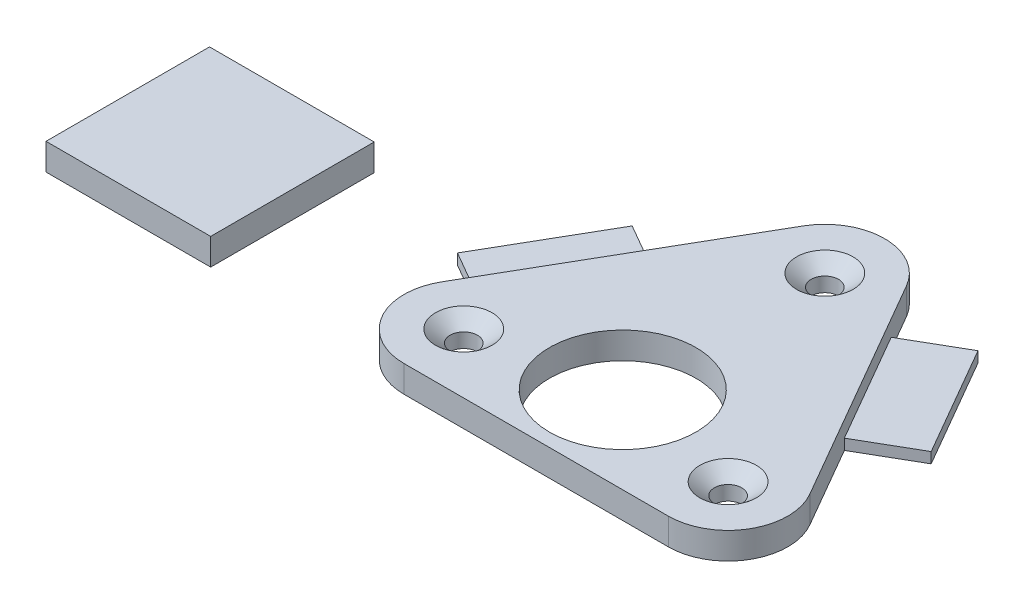
ISO-10303-21;
HEADER;
FILE_DESCRIPTION(('STEP AP214'),'2;1');
FILE_NAME('part.step','',(''),(''),'','','');
FILE_SCHEMA(('AUTOMOTIVE_DESIGN { 1 0 10303 214 1 1 1 1 }'));
ENDSEC;
DATA;
#1=APPLICATION_CONTEXT('core data for automotive mechanical design processes');
#2=APPLICATION_PROTOCOL_DEFINITION('international standard','automotive_design',2000,#1);
#3=PRODUCT_CONTEXT('',#1,'mechanical');
#4=PRODUCT('Part','Part','',(#3));
#5=PRODUCT_RELATED_PRODUCT_CATEGORY('part','',(#4));
#6=PRODUCT_DEFINITION_FORMATION('','',#4);
#7=PRODUCT_DEFINITION_CONTEXT('part definition',#1,'design');
#8=PRODUCT_DEFINITION('design','',#6,#7);
#9=PRODUCT_DEFINITION_SHAPE('','',#8);
#10=(LENGTH_UNIT() NAMED_UNIT(*) SI_UNIT(.MILLI.,.METRE.));
#11=(NAMED_UNIT(*) PLANE_ANGLE_UNIT() SI_UNIT($,.RADIAN.));
#12=(NAMED_UNIT(*) SI_UNIT($,.STERADIAN.) SOLID_ANGLE_UNIT());
#13=UNCERTAINTY_MEASURE_WITH_UNIT(LENGTH_MEASURE(1.E-05),#10,'distance_accuracy_value','');
#14=(GEOMETRIC_REPRESENTATION_CONTEXT(3) GLOBAL_UNCERTAINTY_ASSIGNED_CONTEXT((#13)) GLOBAL_UNIT_ASSIGNED_CONTEXT((#10,
#11,#12)) REPRESENTATION_CONTEXT('',''));
#15=CARTESIAN_POINT('',(0.,0.,0.));
#16=DIRECTION('',(0.,0.,1.));
#17=DIRECTION('',(1.,0.,0.));
#18=AXIS2_PLACEMENT_3D('',#15,#16,#17);
#19=CARTESIAN_POINT('',(-40.3862761223692,-27.6571980713941,8.7169554565989));
#20=DIRECTION('',(1.,0.,0.));
#21=DIRECTION('',(0.,0.,-1.));
#22=AXIS2_PLACEMENT_3D('',#19,#20,#21);
#23=PLANE('',#22);
#24=DIRECTION('',(0.,0.,1.));
#25=VECTOR('',#24,1.);
#26=CARTESIAN_POINT('',(-40.3862761223692,0.,8.7169554565989));
#27=LINE('',#26,#25);
#28=CARTESIAN_POINT('',(-40.3862761223692,0.,-10.7712343473452));
#29=VERTEX_POINT('',#28);
#30=CARTESIAN_POINT('',(-40.3862761223692,0.,8.7169554565989));
#31=VERTEX_POINT('',#30);
#32=EDGE_CURVE('E59',#29,#31,#27,.T.);
#33=ORIENTED_EDGE('',*,*,#32,.F.);
#34=DIRECTION('',(0.,1.,0.));
#35=VECTOR('',#34,1.);
#36=CARTESIAN_POINT('',(-40.3862761223692,-27.6571980713941,-10.7712343473452));
#37=LINE('',#36,#35);
#38=CARTESIAN_POINT('',(-40.3862761223692,3.175,-10.7712343473452));
#39=VERTEX_POINT('',#38);
#40=EDGE_CURVE('E87',#29,#39,#37,.T.);
#41=ORIENTED_EDGE('',*,*,#40,.T.);
#42=DIRECTION('',(0.,0.,-1.));
#43=VECTOR('',#42,1.);
#44=CARTESIAN_POINT('',(-40.3862761223692,3.175,8.7169554565989));
#45=LINE('',#44,#43);
#46=CARTESIAN_POINT('',(-40.3862761223692,3.175,8.7169554565989));
#47=VERTEX_POINT('',#46);
#48=EDGE_CURVE('E91',#47,#39,#45,.T.);
#49=ORIENTED_EDGE('',*,*,#48,.F.);
#50=DIRECTION('',(0.,1.,0.));
#51=VECTOR('',#50,1.);
#52=CARTESIAN_POINT('',(-40.3862761223692,-27.6571980713941,8.7169554565989));
#53=LINE('',#52,#51);
#54=EDGE_CURVE('E114',#31,#47,#53,.T.);
#55=ORIENTED_EDGE('',*,*,#54,.F.);
#56=EDGE_LOOP('',(#33,#41,#49,#55));
#57=FACE_BOUND('',#56,.T.);
#58=ADVANCED_FACE('F51',(#57),#23,.T.);
#59=CARTESIAN_POINT('',(-40.3862761223692,-27.6571980713941,8.7169554565989));
#60=DIRECTION('',(0.,0.,1.));
#61=DIRECTION('',(1.,0.,0.));
#62=AXIS2_PLACEMENT_3D('',#59,#60,#61);
#63=PLANE('',#62);
#64=DIRECTION('',(-1.,0.,0.));
#65=VECTOR('',#64,1.);
#66=CARTESIAN_POINT('',(-40.3862761223692,0.,8.7169554565989));
#67=LINE('',#66,#65);
#68=CARTESIAN_POINT('',(-60.0110325113228,0.,8.7169554565989));
#69=VERTEX_POINT('',#68);
#70=EDGE_CURVE('E65',#31,#69,#67,.T.);
#71=ORIENTED_EDGE('',*,*,#70,.F.);
#72=ORIENTED_EDGE('',*,*,#54,.T.);
#73=DIRECTION('',(1.,0.,0.));
#74=VECTOR('',#73,1.);
#75=CARTESIAN_POINT('',(-40.3862761223692,3.175,8.7169554565989));
#76=LINE('',#75,#74);
#77=CARTESIAN_POINT('',(-60.0110325113228,3.175,8.7169554565989));
#78=VERTEX_POINT('',#77);
#79=EDGE_CURVE('E96',#78,#47,#76,.T.);
#80=ORIENTED_EDGE('',*,*,#79,.F.);
#81=DIRECTION('',(0.,1.,0.));
#82=VECTOR('',#81,1.);
#83=CARTESIAN_POINT('',(-60.0110325113228,-27.6571980713941,8.7169554565989));
#84=LINE('',#83,#82);
#85=EDGE_CURVE('E117',#69,#78,#84,.T.);
#86=ORIENTED_EDGE('',*,*,#85,.F.);
#87=EDGE_LOOP('',(#71,#72,#80,#86));
#88=FACE_BOUND('',#87,.T.);
#89=ADVANCED_FACE('F123',(#88),#63,.T.);
#90=CARTESIAN_POINT('',(-60.0110325113228,-27.6571980713941,8.7169554565989));
#91=DIRECTION('',(-1.,0.,0.));
#92=DIRECTION('',(0.,0.,1.));
#93=AXIS2_PLACEMENT_3D('',#90,#91,#92);
#94=PLANE('',#93);
#95=DIRECTION('',(0.,0.,-1.));
#96=VECTOR('',#95,1.);
#97=CARTESIAN_POINT('',(-60.0110325113228,0.,8.7169554565989));
#98=LINE('',#97,#96);
#99=CARTESIAN_POINT('',(-60.0110325113228,0.,-10.7712343473452));
#100=VERTEX_POINT('',#99);
#101=EDGE_CURVE('E116',#69,#100,#98,.T.);
#102=ORIENTED_EDGE('',*,*,#101,.F.);
#103=ORIENTED_EDGE('',*,*,#85,.T.);
#104=DIRECTION('',(0.,0.,1.));
#105=VECTOR('',#104,1.);
#106=CARTESIAN_POINT('',(-60.0110325113228,3.175,8.7169554565989));
#107=LINE('',#106,#105);
#108=CARTESIAN_POINT('',(-60.0110325113228,3.175,-10.7712343473452));
#109=VERTEX_POINT('',#108);
#110=EDGE_CURVE('E104',#109,#78,#107,.T.);
#111=ORIENTED_EDGE('',*,*,#110,.F.);
#112=DIRECTION('',(0.,1.,0.));
#113=VECTOR('',#112,1.);
#114=CARTESIAN_POINT('',(-60.0110325113228,-27.6571980713941,-10.7712343473452));
#115=LINE('',#114,#113);
#116=EDGE_CURVE('E95',#100,#109,#115,.T.);
#117=ORIENTED_EDGE('',*,*,#116,.F.);
#118=EDGE_LOOP('',(#102,#103,#111,#117));
#119=FACE_BOUND('',#118,.T.);
#120=ADVANCED_FACE('F121',(#119),#94,.T.);
#121=CARTESIAN_POINT('',(-40.3862761223692,-27.6571980713941,-10.7712343473452));
#122=DIRECTION('',(0.,0.,-1.));
#123=DIRECTION('',(-1.,0.,0.));
#124=AXIS2_PLACEMENT_3D('',#121,#122,#123);
#125=PLANE('',#124);
#126=DIRECTION('',(1.,0.,0.));
#127=VECTOR('',#126,1.);
#128=CARTESIAN_POINT('',(-40.3862761223692,0.,-10.7712343473452));
#129=LINE('',#128,#127);
#130=EDGE_CURVE('E12',#100,#29,#129,.T.);
#131=ORIENTED_EDGE('',*,*,#130,.F.);
#132=ORIENTED_EDGE('',*,*,#116,.T.);
#133=DIRECTION('',(-1.,0.,0.));
#134=VECTOR('',#133,1.);
#135=CARTESIAN_POINT('',(-40.3862761223692,3.175,-10.7712343473452));
#136=LINE('',#135,#134);
#137=EDGE_CURVE('E98',#39,#109,#136,.T.);
#138=ORIENTED_EDGE('',*,*,#137,.F.);
#139=ORIENTED_EDGE('',*,*,#40,.F.);
#140=EDGE_LOOP('',(#131,#132,#138,#139));
#141=FACE_BOUND('',#140,.T.);
#142=ADVANCED_FACE('F99',(#141),#125,.T.);
#143=CARTESIAN_POINT('',(0.,3.175,0.));
#144=DIRECTION('',(0.,1.,0.));
#145=DIRECTION('',(0.,0.,1.));
#146=AXIS2_PLACEMENT_3D('',#143,#144,#145);
#147=PLANE('',#146);
#148=ORIENTED_EDGE('',*,*,#48,.T.);
#149=ORIENTED_EDGE('',*,*,#137,.T.);
#150=ORIENTED_EDGE('',*,*,#110,.T.);
#151=ORIENTED_EDGE('',*,*,#79,.T.);
#152=EDGE_LOOP('',(#148,#149,#150,#151));
#153=FACE_BOUND('',#152,.T.);
#154=ADVANCED_FACE('F106',(#153),#147,.T.);
#155=CARTESIAN_POINT('',(15.7498844033853,0.,3.19273021599999));
#156=DIRECTION('',(0.,1.,0.));
#157=DIRECTION('',(0.,0.,1.));
#158=AXIS2_PLACEMENT_3D('',#155,#156,#157);
#159=PLANE('',#158);
#160=ORIENTED_EDGE('',*,*,#32,.T.);
#161=ORIENTED_EDGE('',*,*,#70,.T.);
#162=ORIENTED_EDGE('',*,*,#101,.T.);
#163=ORIENTED_EDGE('',*,*,#130,.T.);
#164=EDGE_LOOP('',(#160,#161,#162,#163));
#165=FACE_BOUND('',#164,.T.);
#166=ADVANCED_FACE('F125',(#165),#159,.F.);
#167=CLOSED_SHELL('',(#58,#89,#120,#142,#154,#166));
#168=MANIFOLD_SOLID_BREP('B2',#167);
#169=CARTESIAN_POINT('',(15.7498844033853,3.175,3.19273021599999));
#170=DIRECTION('',(0.,1.,0.));
#171=DIRECTION('',(0.,0.,1.));
#172=AXIS2_PLACEMENT_3D('',#169,#170,#171);
#173=PLANE('',#172);
#174=CARTESIAN_POINT('',(0.,3.175,-24.086869784));
#175=DIRECTION('',(0.,1.,0.));
#176=DIRECTION('',(0.,0.,1.));
#177=AXIS2_PLACEMENT_3D('',#174,#175,#176);
#178=CIRCLE('',#177,3.3655);
#179=CARTESIAN_POINT('',(0.,3.175,-20.721369784));
#180=VERTEX_POINT('',#179);
#181=EDGE_CURVE('E333',#180,#180,#178,.T.);
#182=ORIENTED_EDGE('',*,*,#181,.F.);
#183=EDGE_LOOP('',(#182));
#184=FACE_BOUND('',#183,.T.);
#185=CARTESIAN_POINT('',(-15.7498844033853,3.175,3.19273021600001));
#186=DIRECTION('',(0.,1.,0.));
#187=DIRECTION('',(0.,0.,1.));
#188=AXIS2_PLACEMENT_3D('',#185,#186,#187);
#189=CIRCLE('',#188,3.3655);
#190=CARTESIAN_POINT('',(-15.7498844033853,3.175,6.55823021600001));
#191=VERTEX_POINT('',#190);
#192=EDGE_CURVE('E349',#191,#191,#189,.T.);
#193=ORIENTED_EDGE('',*,*,#192,.F.);
#194=EDGE_LOOP('',(#193));
#195=FACE_BOUND('',#194,.T.);
#196=CARTESIAN_POINT('',(15.7498844033853,3.175,3.19273021599999));
#197=DIRECTION('',(0.,1.,0.));
#198=DIRECTION('',(0.,0.,1.));
#199=AXIS2_PLACEMENT_3D('',#196,#197,#198);
#200=CIRCLE('',#199,3.3655);
#201=CARTESIAN_POINT('',(15.7498844033853,3.175,6.55823021599999));
#202=VERTEX_POINT('',#201);
#203=EDGE_CURVE('E358',#202,#202,#200,.T.);
#204=ORIENTED_EDGE('',*,*,#203,.F.);
#205=EDGE_LOOP('',(#204));
#206=FACE_BOUND('',#205,.T.);
#207=CARTESIAN_POINT('',(15.7498844033853,3.175,3.19273021599999));
#208=DIRECTION('',(0.,1.,0.));
#209=DIRECTION('',(0.,0.,1.));
#210=AXIS2_PLACEMENT_3D('',#207,#208,#209);
#211=CIRCLE('',#210,7.12601978400001);
#212=CARTESIAN_POINT('',(15.7498844033853,3.175,10.31875));
#213=VERTEX_POINT('',#212);
#214=CARTESIAN_POINT('',(21.9211985641998,3.175,-0.370279676000014));
#215=VERTEX_POINT('',#214);
#216=EDGE_CURVE('E375',#213,#215,#211,.T.);
#217=ORIENTED_EDGE('',*,*,#216,.T.);
#218=DIRECTION('',(-0.5,0.,-0.866025403784438));
#219=VECTOR('',#218,1.);
#220=CARTESIAN_POINT('',(6.1713141608145,3.175,-27.649879676));
#221=LINE('',#220,#219);
#222=CARTESIAN_POINT('',(6.1713141608145,3.175,-27.649879676));
#223=VERTEX_POINT('',#222);
#224=EDGE_CURVE('E378',#215,#223,#221,.T.);
#225=ORIENTED_EDGE('',*,*,#224,.T.);
#226=CARTESIAN_POINT('',(0.,3.175,-24.086869784));
#227=DIRECTION('',(0.,1.,0.));
#228=DIRECTION('',(0.,0.,1.));
#229=AXIS2_PLACEMENT_3D('',#226,#227,#228);
#230=CIRCLE('',#229,7.126019784);
#231=CARTESIAN_POINT('',(-6.1713141608145,3.175,-27.649879676));
#232=VERTEX_POINT('',#231);
#233=EDGE_CURVE('E381',#223,#232,#230,.T.);
#234=ORIENTED_EDGE('',*,*,#233,.T.);
#235=DIRECTION('',(-0.5,0.,0.866025403784438));
#236=VECTOR('',#235,1.);
#237=CARTESIAN_POINT('',(-6.1713141608145,3.175,-27.649879676));
#238=LINE('',#237,#236);
#239=CARTESIAN_POINT('',(-21.9211985641998,3.175,-0.370279675999992));
#240=VERTEX_POINT('',#239);
#241=EDGE_CURVE('E383',#232,#240,#238,.T.);
#242=ORIENTED_EDGE('',*,*,#241,.T.);
#243=CARTESIAN_POINT('',(-15.7498844033853,3.175,3.19273021600001));
#244=DIRECTION('',(0.,1.,0.));
#245=DIRECTION('',(0.,0.,1.));
#246=AXIS2_PLACEMENT_3D('',#243,#244,#245);
#247=CIRCLE('',#246,7.12601978400001);
#248=CARTESIAN_POINT('',(-15.7498844033853,3.175,10.31875));
#249=VERTEX_POINT('',#248);
#250=EDGE_CURVE('E387',#240,#249,#247,.T.);
#251=ORIENTED_EDGE('',*,*,#250,.T.);
#252=DIRECTION('',(1.,0.,0.));
#253=VECTOR('',#252,1.);
#254=CARTESIAN_POINT('',(15.7498844033853,3.175,10.31875));
#255=LINE('',#254,#253);
#256=EDGE_CURVE('E408',#249,#213,#255,.T.);
#257=ORIENTED_EDGE('',*,*,#256,.T.);
#258=EDGE_LOOP('',(#217,#225,#234,#242,#251,#257));
#259=FACE_BOUND('',#258,.T.);
#260=CARTESIAN_POINT('',(0.,3.175,0.));
#261=DIRECTION('',(0.,1.,0.));
#262=DIRECTION('',(0.,0.,1.));
#263=AXIS2_PLACEMENT_3D('',#260,#261,#262);
#264=CIRCLE('',#263,8.73125);
#265=CARTESIAN_POINT('',(0.,3.175,8.73125));
#266=VERTEX_POINT('',#265);
#267=EDGE_CURVE('E368',#266,#266,#264,.T.);
#268=ORIENTED_EDGE('',*,*,#267,.F.);
#269=EDGE_LOOP('',(#268));
#270=FACE_BOUND('',#269,.T.);
#271=ADVANCED_FACE('F176',(#184,#195,#206,#259,#270),#173,.T.);
#272=CARTESIAN_POINT('',(15.7498844033853,0.,3.19273021599999));
#273=DIRECTION('',(0.,1.,0.));
#274=DIRECTION('',(0.,0.,1.));
#275=AXIS2_PLACEMENT_3D('',#272,#273,#274);
#276=PLANE('',#275);
#277=CARTESIAN_POINT('',(0.,0.,-24.086869784));
#278=DIRECTION('',(0.,1.,0.));
#279=DIRECTION('',(0.,0.,1.));
#280=AXIS2_PLACEMENT_3D('',#277,#278,#279);
#281=CIRCLE('',#280,1.63195);
#282=CARTESIAN_POINT('',(0.,0.,-22.454919784));
#283=VERTEX_POINT('',#282);
#284=EDGE_CURVE('E346',#283,#283,#281,.T.);
#285=ORIENTED_EDGE('',*,*,#284,.T.);
#286=EDGE_LOOP('',(#285));
#287=FACE_BOUND('',#286,.T.);
#288=CARTESIAN_POINT('',(-15.7498844033853,0.,3.19273021600001));
#289=DIRECTION('',(0.,1.,0.));
#290=DIRECTION('',(0.,0.,1.));
#291=AXIS2_PLACEMENT_3D('',#288,#289,#290);
#292=CIRCLE('',#291,1.63195);
#293=CARTESIAN_POINT('',(-15.7498844033853,0.,4.82468021600001));
#294=VERTEX_POINT('',#293);
#295=EDGE_CURVE('E355',#294,#294,#292,.T.);
#296=ORIENTED_EDGE('',*,*,#295,.T.);
#297=EDGE_LOOP('',(#296));
#298=FACE_BOUND('',#297,.T.);
#299=CARTESIAN_POINT('',(15.7498844033853,0.,3.19273021599999));
#300=DIRECTION('',(0.,1.,0.));
#301=DIRECTION('',(0.,0.,1.));
#302=AXIS2_PLACEMENT_3D('',#299,#300,#301);
#303=CIRCLE('',#302,1.63195);
#304=CARTESIAN_POINT('',(15.7498844033853,0.,4.82468021599999));
#305=VERTEX_POINT('',#304);
#306=EDGE_CURVE('E364',#305,#305,#303,.T.);
#307=ORIENTED_EDGE('',*,*,#306,.T.);
#308=EDGE_LOOP('',(#307));
#309=FACE_BOUND('',#308,.T.);
#310=CARTESIAN_POINT('',(15.7498844033853,0.,3.19273021599999));
#311=DIRECTION('',(0.,1.,0.));
#312=DIRECTION('',(0.,0.,1.));
#313=AXIS2_PLACEMENT_3D('',#310,#311,#312);
#314=CIRCLE('',#313,7.12601978400001);
#315=CARTESIAN_POINT('',(15.7498844033853,0.,10.31875));
#316=VERTEX_POINT('',#315);
#317=CARTESIAN_POINT('',(21.9211985641998,0.,-0.370279676000014));
#318=VERTEX_POINT('',#317);
#319=EDGE_CURVE('E371',#316,#318,#314,.T.);
#320=ORIENTED_EDGE('',*,*,#319,.F.);
#321=DIRECTION('',(1.,0.,0.));
#322=VECTOR('',#321,1.);
#323=CARTESIAN_POINT('',(15.7498844033853,0.,10.31875));
#324=LINE('',#323,#322);
#325=CARTESIAN_POINT('',(-15.7498844033853,0.,10.31875));
#326=VERTEX_POINT('',#325);
#327=EDGE_CURVE('E379',#326,#316,#324,.T.);
#328=ORIENTED_EDGE('',*,*,#327,.F.);
#329=CARTESIAN_POINT('',(-15.7498844033853,0.,3.19273021600001));
#330=DIRECTION('',(0.,1.,0.));
#331=DIRECTION('',(0.,0.,1.));
#332=AXIS2_PLACEMENT_3D('',#329,#330,#331);
#333=CIRCLE('',#332,7.12601978400001);
#334=CARTESIAN_POINT('',(-21.9211985641998,0.,-0.370279675999992));
#335=VERTEX_POINT('',#334);
#336=EDGE_CURVE('E398',#335,#326,#333,.T.);
#337=ORIENTED_EDGE('',*,*,#336,.F.);
#338=DIRECTION('',(-0.5,0.,0.866025403784438));
#339=VECTOR('',#338,1.);
#340=CARTESIAN_POINT('',(-6.1713141608145,0.,-27.649879676));
#341=LINE('',#340,#339);
#342=CARTESIAN_POINT('',(-20.392453659478,0.,-3.01814352279022));
#343=VERTEX_POINT('',#342);
#344=EDGE_CURVE('E399',#343,#335,#341,.T.);
#345=ORIENTED_EDGE('',*,*,#344,.F.);
#346=DIRECTION('',(-0.866025403784439,0.,-0.5));
#347=VECTOR('',#346,1.);
#348=CARTESIAN_POINT('',(-20.392453659478,0.,-3.01814352279022));
#349=LINE('',#348,#347);
#350=CARTESIAN_POINT('',(-25.8754915799858,0.,-6.18377694217233));
#351=VERTEX_POINT('',#350);
#352=EDGE_CURVE('E305',#343,#351,#349,.T.);
#353=ORIENTED_EDGE('',*,*,#352,.T.);
#354=DIRECTION('',(0.5,0.,-0.866025403784438));
#355=VECTOR('',#354,1.);
#356=CARTESIAN_POINT('',(-18.2554915799858,0.,-19.3820040958472));
#357=LINE('',#356,#355);
#358=CARTESIAN_POINT('',(-18.2554915799858,0.,-19.3820040958472));
#359=VERTEX_POINT('',#358);
#360=EDGE_CURVE('E282',#351,#359,#357,.T.);
#361=ORIENTED_EDGE('',*,*,#360,.T.);
#362=DIRECTION('',(0.866025403784438,0.,0.5));
#363=VECTOR('',#362,1.);
#364=CARTESIAN_POINT('',(-12.772453659478,0.,-16.2163706764651));
#365=LINE('',#364,#363);
#366=CARTESIAN_POINT('',(-12.772453659478,0.,-16.2163706764651));
#367=VERTEX_POINT('',#366);
#368=EDGE_CURVE('E302',#359,#367,#365,.T.);
#369=ORIENTED_EDGE('',*,*,#368,.T.);
#370=CARTESIAN_POINT('',(-6.1713141608145,0.,-27.649879676));
#371=VERTEX_POINT('',#370);
#372=EDGE_CURVE('E393',#371,#367,#341,.T.);
#373=ORIENTED_EDGE('',*,*,#372,.F.);
#374=CARTESIAN_POINT('',(0.,0.,-24.086869784));
#375=DIRECTION('',(0.,1.,0.));
#376=DIRECTION('',(0.,0.,1.));
#377=AXIS2_PLACEMENT_3D('',#374,#375,#376);
#378=CIRCLE('',#377,7.126019784);
#379=CARTESIAN_POINT('',(6.1713141608145,0.,-27.649879676));
#380=VERTEX_POINT('',#379);
#381=EDGE_CURVE('E400',#380,#371,#378,.T.);
#382=ORIENTED_EDGE('',*,*,#381,.F.);
#383=DIRECTION('',(-0.5,0.,-0.866025403784438));
#384=VECTOR('',#383,1.);
#385=CARTESIAN_POINT('',(6.1713141608145,0.,-27.649879676));
#386=LINE('',#385,#384);
#387=CARTESIAN_POINT('',(8.66921520518639,0.,-23.3233881548685));
#388=VERTEX_POINT('',#387);
#389=EDGE_CURVE('E429',#388,#380,#386,.T.);
#390=ORIENTED_EDGE('',*,*,#389,.F.);
#391=DIRECTION('',(0.866025403784439,0.,-0.5));
#392=VECTOR('',#391,1.);
#393=CARTESIAN_POINT('',(8.66921520518639,0.,-23.3233881548685));
#394=LINE('',#393,#392);
#395=CARTESIAN_POINT('',(15.2291762894605,0.,-27.1107834527477));
#396=VERTEX_POINT('',#395);
#397=EDGE_CURVE('E326',#388,#396,#394,.T.);
#398=ORIENTED_EDGE('',*,*,#397,.T.);
#399=DIRECTION('',(0.5,0.,0.866025403784439));
#400=VECTOR('',#399,1.);
#401=CARTESIAN_POINT('',(22.8491762894605,0.,-13.9125562990728));
#402=LINE('',#401,#400);
#403=CARTESIAN_POINT('',(22.8491762894605,0.,-13.9125562990728));
#404=VERTEX_POINT('',#403);
#405=EDGE_CURVE('E315',#396,#404,#402,.T.);
#406=ORIENTED_EDGE('',*,*,#405,.T.);
#407=DIRECTION('',(-0.866025403784439,0.,0.5));
#408=VECTOR('',#407,1.);
#409=CARTESIAN_POINT('',(16.2892152051864,0.,-10.1251610011937));
#410=LINE('',#409,#408);
#411=CARTESIAN_POINT('',(16.2892152051864,0.,-10.1251610011937));
#412=VERTEX_POINT('',#411);
#413=EDGE_CURVE('E308',#404,#412,#410,.T.);
#414=ORIENTED_EDGE('',*,*,#413,.T.);
#415=EDGE_CURVE('E430',#318,#412,#386,.T.);
#416=ORIENTED_EDGE('',*,*,#415,.F.);
#417=EDGE_LOOP('',(#320,#328,#337,#345,#353,#361,#369,#373,#382,#390,#398,#406,#414,#416));
#418=FACE_BOUND('',#417,.T.);
#419=CARTESIAN_POINT('',(0.,0.,0.));
#420=DIRECTION('',(0.,1.,0.));
#421=DIRECTION('',(0.,0.,1.));
#422=AXIS2_PLACEMENT_3D('',#419,#420,#421);
#423=CIRCLE('',#422,8.73125);
#424=CARTESIAN_POINT('',(0.,0.,8.73125));
#425=VERTEX_POINT('',#424);
#426=EDGE_CURVE('E367',#425,#425,#423,.T.);
#427=ORIENTED_EDGE('',*,*,#426,.T.);
#428=EDGE_LOOP('',(#427));
#429=FACE_BOUND('',#428,.T.);
#430=ADVANCED_FACE('F427',(#287,#298,#309,#418,#429),#276,.F.);
#431=CARTESIAN_POINT('',(15.7498844033853,3.175,3.19273021599999));
#432=DIRECTION('',(0.,-1.,0.));
#433=DIRECTION('',(0.,0.,-1.));
#434=AXIS2_PLACEMENT_3D('',#431,#432,#433);
#435=CYLINDRICAL_SURFACE('',#434,7.12601978400001);
#436=ORIENTED_EDGE('',*,*,#319,.T.);
#437=DIRECTION('',(0.,-1.,0.));
#438=VECTOR('',#437,1.);
#439=CARTESIAN_POINT('',(21.9211985641998,3.175,-0.370279676000014));
#440=LINE('',#439,#438);
#441=EDGE_CURVE('E49',#215,#318,#440,.T.);
#442=ORIENTED_EDGE('',*,*,#441,.F.);
#443=ORIENTED_EDGE('',*,*,#216,.F.);
#444=DIRECTION('',(0.,-1.,0.));
#445=VECTOR('',#444,1.);
#446=CARTESIAN_POINT('',(15.7498844033853,3.175,10.31875));
#447=LINE('',#446,#445);
#448=EDGE_CURVE('E404',#213,#316,#447,.T.);
#449=ORIENTED_EDGE('',*,*,#448,.T.);
#450=EDGE_LOOP('',(#436,#442,#443,#449));
#451=FACE_BOUND('',#450,.T.);
#452=ADVANCED_FACE('F178',(#451),#435,.T.);
#453=CARTESIAN_POINT('',(6.1713141608145,3.175,-27.649879676));
#454=DIRECTION('',(-0.866025403784438,0.,0.5));
#455=DIRECTION('',(0.5,0.,0.866025403784438));
#456=AXIS2_PLACEMENT_3D('',#453,#454,#455);
#457=PLANE('',#456);
#458=ORIENTED_EDGE('',*,*,#415,.T.);
#459=DIRECTION('',(0.,-1.,0.));
#460=VECTOR('',#459,1.);
#461=CARTESIAN_POINT('',(16.2892152051864,1.27,-10.1251610011937));
#462=LINE('',#461,#460);
#463=CARTESIAN_POINT('',(16.2892152051864,1.27,-10.1251610011937));
#464=VERTEX_POINT('',#463);
#465=EDGE_CURVE('E323',#464,#412,#462,.T.);
#466=ORIENTED_EDGE('',*,*,#465,.F.);
#467=DIRECTION('',(-0.500000000000001,0.,-0.866025403784438));
#468=VECTOR('',#467,1.);
#469=CARTESIAN_POINT('',(16.2892152051864,1.27,-10.1251610011937));
#470=LINE('',#469,#468);
#471=CARTESIAN_POINT('',(8.66921520518639,1.27,-23.3233881548685));
#472=VERTEX_POINT('',#471);
#473=EDGE_CURVE('E314',#464,#472,#470,.T.);
#474=ORIENTED_EDGE('',*,*,#473,.T.);
#475=DIRECTION('',(0.,-1.,0.));
#476=VECTOR('',#475,1.);
#477=CARTESIAN_POINT('',(8.66921520518639,1.27,-23.3233881548685));
#478=LINE('',#477,#476);
#479=EDGE_CURVE('E336',#472,#388,#478,.T.);
#480=ORIENTED_EDGE('',*,*,#479,.T.);
#481=ORIENTED_EDGE('',*,*,#389,.T.);
#482=DIRECTION('',(0.,-1.,0.));
#483=VECTOR('',#482,1.);
#484=CARTESIAN_POINT('',(6.1713141608145,3.175,-27.649879676));
#485=LINE('',#484,#483);
#486=EDGE_CURVE('E184',#223,#380,#485,.T.);
#487=ORIENTED_EDGE('',*,*,#486,.F.);
#488=ORIENTED_EDGE('',*,*,#224,.F.);
#489=ORIENTED_EDGE('',*,*,#441,.T.);
#490=EDGE_LOOP('',(#458,#466,#474,#480,#481,#487,#488,#489));
#491=FACE_BOUND('',#490,.T.);
#492=ADVANCED_FACE('F453',(#491),#457,.F.);
#493=CARTESIAN_POINT('',(0.,3.175,-24.086869784));
#494=DIRECTION('',(0.,-1.,0.));
#495=DIRECTION('',(0.,0.,-1.));
#496=AXIS2_PLACEMENT_3D('',#493,#494,#495);
#497=CYLINDRICAL_SURFACE('',#496,7.126019784);
#498=ORIENTED_EDGE('',*,*,#381,.T.);
#499=DIRECTION('',(0.,-1.,0.));
#500=VECTOR('',#499,1.);
#501=CARTESIAN_POINT('',(-6.1713141608145,3.175,-27.649879676));
#502=LINE('',#501,#500);
#503=EDGE_CURVE('E414',#232,#371,#502,.T.);
#504=ORIENTED_EDGE('',*,*,#503,.F.);
#505=ORIENTED_EDGE('',*,*,#233,.F.);
#506=ORIENTED_EDGE('',*,*,#486,.T.);
#507=EDGE_LOOP('',(#498,#504,#505,#506));
#508=FACE_BOUND('',#507,.T.);
#509=ADVANCED_FACE('F421',(#508),#497,.T.);
#510=CARTESIAN_POINT('',(-6.1713141608145,3.175,-27.649879676));
#511=DIRECTION('',(0.866025403784438,0.,0.5));
#512=DIRECTION('',(0.5,0.,-0.866025403784438));
#513=AXIS2_PLACEMENT_3D('',#510,#511,#512);
#514=PLANE('',#513);
#515=ORIENTED_EDGE('',*,*,#372,.T.);
#516=DIRECTION('',(0.,-1.,0.));
#517=VECTOR('',#516,1.);
#518=CARTESIAN_POINT('',(-12.772453659478,1.27,-16.2163706764651));
#519=LINE('',#518,#517);
#520=CARTESIAN_POINT('',(-12.772453659478,1.27,-16.2163706764651));
#521=VERTEX_POINT('',#520);
#522=EDGE_CURVE('E196',#521,#367,#519,.T.);
#523=ORIENTED_EDGE('',*,*,#522,.F.);
#524=DIRECTION('',(-0.499999999999999,0.,0.866025403784439));
#525=VECTOR('',#524,1.);
#526=CARTESIAN_POINT('',(-12.772453659478,1.27,-16.2163706764651));
#527=LINE('',#526,#525);
#528=CARTESIAN_POINT('',(-20.392453659478,1.27,-3.01814352279022));
#529=VERTEX_POINT('',#528);
#530=EDGE_CURVE('E191',#521,#529,#527,.T.);
#531=ORIENTED_EDGE('',*,*,#530,.T.);
#532=DIRECTION('',(0.,-1.,0.));
#533=VECTOR('',#532,1.);
#534=CARTESIAN_POINT('',(-20.392453659478,1.27,-3.01814352279022));
#535=LINE('',#534,#533);
#536=EDGE_CURVE('E287',#529,#343,#535,.T.);
#537=ORIENTED_EDGE('',*,*,#536,.T.);
#538=ORIENTED_EDGE('',*,*,#344,.T.);
#539=DIRECTION('',(0.,-1.,0.));
#540=VECTOR('',#539,1.);
#541=CARTESIAN_POINT('',(-21.9211985641998,3.175,-0.370279675999992));
#542=LINE('',#541,#540);
#543=EDGE_CURVE('E411',#240,#335,#542,.T.);
#544=ORIENTED_EDGE('',*,*,#543,.F.);
#545=ORIENTED_EDGE('',*,*,#241,.F.);
#546=ORIENTED_EDGE('',*,*,#503,.T.);
#547=EDGE_LOOP('',(#515,#523,#531,#537,#538,#544,#545,#546));
#548=FACE_BOUND('',#547,.T.);
#549=ADVANCED_FACE('F498',(#548),#514,.F.);
#550=CARTESIAN_POINT('',(-15.7498844033853,3.175,3.19273021600001));
#551=DIRECTION('',(0.,-1.,0.));
#552=DIRECTION('',(0.,0.,-1.));
#553=AXIS2_PLACEMENT_3D('',#550,#551,#552);
#554=CYLINDRICAL_SURFACE('',#553,7.12601978400001);
#555=ORIENTED_EDGE('',*,*,#336,.T.);
#556=DIRECTION('',(0.,-1.,0.));
#557=VECTOR('',#556,1.);
#558=CARTESIAN_POINT('',(-15.7498844033853,3.175,10.31875));
#559=LINE('',#558,#557);
#560=EDGE_CURVE('E407',#249,#326,#559,.T.);
#561=ORIENTED_EDGE('',*,*,#560,.F.);
#562=ORIENTED_EDGE('',*,*,#250,.F.);
#563=ORIENTED_EDGE('',*,*,#543,.T.);
#564=EDGE_LOOP('',(#555,#561,#562,#563));
#565=FACE_BOUND('',#564,.T.);
#566=ADVANCED_FACE('F445',(#565),#554,.T.);
#567=CARTESIAN_POINT('',(15.7498844033853,3.175,10.31875));
#568=DIRECTION('',(0.,0.,-1.));
#569=DIRECTION('',(-1.,0.,0.));
#570=AXIS2_PLACEMENT_3D('',#567,#568,#569);
#571=PLANE('',#570);
#572=ORIENTED_EDGE('',*,*,#327,.T.);
#573=ORIENTED_EDGE('',*,*,#448,.F.);
#574=ORIENTED_EDGE('',*,*,#256,.F.);
#575=ORIENTED_EDGE('',*,*,#560,.T.);
#576=EDGE_LOOP('',(#572,#573,#574,#575));
#577=FACE_BOUND('',#576,.T.);
#578=ADVANCED_FACE('F449',(#577),#571,.F.);
#579=CARTESIAN_POINT('',(0.,3.175,0.));
#580=DIRECTION('',(0.,-1.,0.));
#581=DIRECTION('',(0.,0.,-1.));
#582=AXIS2_PLACEMENT_3D('',#579,#580,#581);
#583=CYLINDRICAL_SURFACE('',#582,8.73125);
#584=ORIENTED_EDGE('',*,*,#267,.T.);
#585=EDGE_LOOP('',(#584));
#586=FACE_BOUND('',#585,.T.);
#587=ORIENTED_EDGE('',*,*,#426,.F.);
#588=EDGE_LOOP('',(#587));
#589=FACE_BOUND('',#588,.T.);
#590=ADVANCED_FACE('F491',(#586,#589),#583,.F.);
#591=CARTESIAN_POINT('',(15.7498844033853,3.175,3.19273021599999));
#592=DIRECTION('',(0.,1.,0.));
#593=DIRECTION('',(0.,0.,1.));
#594=AXIS2_PLACEMENT_3D('',#591,#592,#593);
#595=CYLINDRICAL_SURFACE('',#594,1.63195);
#596=ORIENTED_EDGE('',*,*,#306,.F.);
#597=EDGE_LOOP('',(#596));
#598=FACE_BOUND('',#597,.T.);
#599=CARTESIAN_POINT('',(15.7498844033853,1.72037883437263,3.19273021599999));
#600=DIRECTION('',(0.,1.,0.));
#601=DIRECTION('',(0.,0.,1.));
#602=AXIS2_PLACEMENT_3D('',#599,#600,#601);
#603=CIRCLE('',#602,1.63195);
#604=CARTESIAN_POINT('',(15.7498844033853,1.72037883437263,4.82468021599999));
#605=VERTEX_POINT('',#604);
#606=EDGE_CURVE('E361',#605,#605,#603,.T.);
#607=ORIENTED_EDGE('',*,*,#606,.T.);
#608=EDGE_LOOP('',(#607));
#609=FACE_BOUND('',#608,.T.);
#610=ADVANCED_FACE('F607',(#598,#609),#595,.F.);
#611=CARTESIAN_POINT('',(15.7498844033853,3.175,3.19273021599999));
#612=DIRECTION('',(0.,1.,0.));
#613=DIRECTION('',(0.,0.,1.));
#614=AXIS2_PLACEMENT_3D('',#611,#612,#613);
#615=CONICAL_SURFACE('',#614,3.3655,0.872664625997164);
#616=ORIENTED_EDGE('',*,*,#606,.F.);
#617=EDGE_LOOP('',(#616));
#618=FACE_BOUND('',#617,.T.);
#619=ORIENTED_EDGE('',*,*,#203,.T.);
#620=EDGE_LOOP('',(#619));
#621=FACE_BOUND('',#620,.T.);
#622=ADVANCED_FACE('F611',(#618,#621),#615,.F.);
#623=CARTESIAN_POINT('',(-15.7498844033853,3.175,3.19273021600001));
#624=DIRECTION('',(0.,1.,0.));
#625=DIRECTION('',(0.,0.,1.));
#626=AXIS2_PLACEMENT_3D('',#623,#624,#625);
#627=CYLINDRICAL_SURFACE('',#626,1.63195);
#628=ORIENTED_EDGE('',*,*,#295,.F.);
#629=EDGE_LOOP('',(#628));
#630=FACE_BOUND('',#629,.T.);
#631=CARTESIAN_POINT('',(-15.7498844033853,1.72037883437263,3.19273021600001));
#632=DIRECTION('',(0.,1.,0.));
#633=DIRECTION('',(0.,0.,1.));
#634=AXIS2_PLACEMENT_3D('',#631,#632,#633);
#635=CIRCLE('',#634,1.63195);
#636=CARTESIAN_POINT('',(-15.7498844033853,1.72037883437263,4.82468021600001));
#637=VERTEX_POINT('',#636);
#638=EDGE_CURVE('E352',#637,#637,#635,.T.);
#639=ORIENTED_EDGE('',*,*,#638,.T.);
#640=EDGE_LOOP('',(#639));
#641=FACE_BOUND('',#640,.T.);
#642=ADVANCED_FACE('F619',(#630,#641),#627,.F.);
#643=CARTESIAN_POINT('',(-15.7498844033853,3.175,3.19273021600001));
#644=DIRECTION('',(0.,1.,0.));
#645=DIRECTION('',(0.,0.,1.));
#646=AXIS2_PLACEMENT_3D('',#643,#644,#645);
#647=CONICAL_SURFACE('',#646,3.3655,0.872664625997164);
#648=ORIENTED_EDGE('',*,*,#638,.F.);
#649=EDGE_LOOP('',(#648));
#650=FACE_BOUND('',#649,.T.);
#651=ORIENTED_EDGE('',*,*,#192,.T.);
#652=EDGE_LOOP('',(#651));
#653=FACE_BOUND('',#652,.T.);
#654=ADVANCED_FACE('F599',(#650,#653),#647,.F.);
#655=CARTESIAN_POINT('',(0.,3.175,-24.086869784));
#656=DIRECTION('',(0.,1.,0.));
#657=DIRECTION('',(0.,0.,1.));
#658=AXIS2_PLACEMENT_3D('',#655,#656,#657);
#659=CYLINDRICAL_SURFACE('',#658,1.63195);
#660=ORIENTED_EDGE('',*,*,#284,.F.);
#661=EDGE_LOOP('',(#660));
#662=FACE_BOUND('',#661,.T.);
#663=CARTESIAN_POINT('',(0.,1.72037883437263,-24.086869784));
#664=DIRECTION('',(0.,1.,0.));
#665=DIRECTION('',(0.,0.,1.));
#666=AXIS2_PLACEMENT_3D('',#663,#664,#665);
#667=CIRCLE('',#666,1.63195);
#668=CARTESIAN_POINT('',(0.,1.72037883437263,-22.454919784));
#669=VERTEX_POINT('',#668);
#670=EDGE_CURVE('E343',#669,#669,#667,.T.);
#671=ORIENTED_EDGE('',*,*,#670,.T.);
#672=EDGE_LOOP('',(#671));
#673=FACE_BOUND('',#672,.T.);
#674=ADVANCED_FACE('F596',(#662,#673),#659,.F.);
#675=CARTESIAN_POINT('',(0.,3.175,-24.086869784));
#676=DIRECTION('',(0.,1.,0.));
#677=DIRECTION('',(0.,0.,1.));
#678=AXIS2_PLACEMENT_3D('',#675,#676,#677);
#679=CONICAL_SURFACE('',#678,3.3655,0.872664625997165);
#680=ORIENTED_EDGE('',*,*,#670,.F.);
#681=EDGE_LOOP('',(#680));
#682=FACE_BOUND('',#681,.T.);
#683=ORIENTED_EDGE('',*,*,#181,.T.);
#684=EDGE_LOOP('',(#683));
#685=FACE_BOUND('',#684,.T.);
#686=ADVANCED_FACE('F477',(#682,#685),#679,.F.);
#687=CARTESIAN_POINT('',(16.2892152051864,1.27,-10.1251610011937));
#688=DIRECTION('',(0.5,0.,0.866025403784439));
#689=DIRECTION('',(0.866025403784439,0.,-0.5));
#690=AXIS2_PLACEMENT_3D('',#687,#688,#689);
#691=PLANE('',#690);
#692=ORIENTED_EDGE('',*,*,#413,.F.);
#693=DIRECTION('',(0.,-1.,0.));
#694=VECTOR('',#693,1.);
#695=CARTESIAN_POINT('',(22.8491762894605,1.27,-13.9125562990728));
#696=LINE('',#695,#694);
#697=CARTESIAN_POINT('',(22.8491762894605,1.27,-13.9125562990728));
#698=VERTEX_POINT('',#697);
#699=EDGE_CURVE('E331',#698,#404,#696,.T.);
#700=ORIENTED_EDGE('',*,*,#699,.F.);
#701=DIRECTION('',(-0.866025403784439,0.,0.5));
#702=VECTOR('',#701,1.);
#703=CARTESIAN_POINT('',(16.2892152051864,1.27,-10.1251610011937));
#704=LINE('',#703,#702);
#705=EDGE_CURVE('E311',#698,#464,#704,.T.);
#706=ORIENTED_EDGE('',*,*,#705,.T.);
#707=ORIENTED_EDGE('',*,*,#465,.T.);
#708=EDGE_LOOP('',(#692,#700,#706,#707));
#709=FACE_BOUND('',#708,.T.);
#710=ADVANCED_FACE('F457',(#709),#691,.T.);
#711=CARTESIAN_POINT('',(22.8491762894605,1.27,-13.9125562990728));
#712=DIRECTION('',(0.866025403784439,0.,-0.5));
#713=DIRECTION('',(-0.5,0.,-0.866025403784439));
#714=AXIS2_PLACEMENT_3D('',#711,#712,#713);
#715=PLANE('',#714);
#716=ORIENTED_EDGE('',*,*,#405,.F.);
#717=DIRECTION('',(0.,-1.,0.));
#718=VECTOR('',#717,1.);
#719=CARTESIAN_POINT('',(15.2291762894605,1.27,-27.1107834527477));
#720=LINE('',#719,#718);
#721=CARTESIAN_POINT('',(15.2291762894605,1.27,-27.1107834527477));
#722=VERTEX_POINT('',#721);
#723=EDGE_CURVE('E334',#722,#396,#720,.T.);
#724=ORIENTED_EDGE('',*,*,#723,.F.);
#725=DIRECTION('',(0.5,0.,0.866025403784439));
#726=VECTOR('',#725,1.);
#727=CARTESIAN_POINT('',(22.8491762894605,1.27,-13.9125562990728));
#728=LINE('',#727,#726);
#729=EDGE_CURVE('E320',#722,#698,#728,.T.);
#730=ORIENTED_EDGE('',*,*,#729,.T.);
#731=ORIENTED_EDGE('',*,*,#699,.T.);
#732=EDGE_LOOP('',(#716,#724,#730,#731));
#733=FACE_BOUND('',#732,.T.);
#734=ADVANCED_FACE('F469',(#733),#715,.T.);
#735=CARTESIAN_POINT('',(8.66921520518639,1.27,-23.3233881548685));
#736=DIRECTION('',(-0.5,0.,-0.866025403784439));
#737=DIRECTION('',(-0.866025403784439,0.,0.5));
#738=AXIS2_PLACEMENT_3D('',#735,#736,#737);
#739=PLANE('',#738);
#740=ORIENTED_EDGE('',*,*,#397,.F.);
#741=ORIENTED_EDGE('',*,*,#479,.F.);
#742=DIRECTION('',(0.866025403784439,0.,-0.5));
#743=VECTOR('',#742,1.);
#744=CARTESIAN_POINT('',(8.66921520518639,1.27,-23.3233881548685));
#745=LINE('',#744,#743);
#746=EDGE_CURVE('E317',#472,#722,#745,.T.);
#747=ORIENTED_EDGE('',*,*,#746,.T.);
#748=ORIENTED_EDGE('',*,*,#723,.T.);
#749=EDGE_LOOP('',(#740,#741,#747,#748));
#750=FACE_BOUND('',#749,.T.);
#751=ADVANCED_FACE('F467',(#750),#739,.T.);
#752=CARTESIAN_POINT('',(0.,1.27,0.));
#753=DIRECTION('',(0.,1.,0.));
#754=DIRECTION('',(0.,0.,1.));
#755=AXIS2_PLACEMENT_3D('',#752,#753,#754);
#756=PLANE('',#755);
#757=ORIENTED_EDGE('',*,*,#705,.F.);
#758=ORIENTED_EDGE('',*,*,#729,.F.);
#759=ORIENTED_EDGE('',*,*,#746,.F.);
#760=ORIENTED_EDGE('',*,*,#473,.F.);
#761=EDGE_LOOP('',(#757,#758,#759,#760));
#762=FACE_BOUND('',#761,.T.);
#763=ADVANCED_FACE('F463',(#762),#756,.T.);
#764=CARTESIAN_POINT('',(-12.772453659478,1.27,-16.2163706764651));
#765=DIRECTION('',(0.5,0.,-0.866025403784439));
#766=DIRECTION('',(-0.866025403784438,0.,-0.5));
#767=AXIS2_PLACEMENT_3D('',#764,#765,#766);
#768=PLANE('',#767);
#769=ORIENTED_EDGE('',*,*,#368,.F.);
#770=DIRECTION('',(0.,-1.,0.));
#771=VECTOR('',#770,1.);
#772=CARTESIAN_POINT('',(-18.2554915799858,1.27,-19.3820040958472));
#773=LINE('',#772,#771);
#774=CARTESIAN_POINT('',(-18.2554915799858,1.27,-19.3820040958472));
#775=VERTEX_POINT('',#774);
#776=EDGE_CURVE('E286',#775,#359,#773,.T.);
#777=ORIENTED_EDGE('',*,*,#776,.F.);
#778=DIRECTION('',(0.866025403784438,0.,0.5));
#779=VECTOR('',#778,1.);
#780=CARTESIAN_POINT('',(-12.772453659478,1.27,-16.2163706764651));
#781=LINE('',#780,#779);
#782=EDGE_CURVE('E297',#775,#521,#781,.T.);
#783=ORIENTED_EDGE('',*,*,#782,.T.);
#784=ORIENTED_EDGE('',*,*,#522,.T.);
#785=EDGE_LOOP('',(#769,#777,#783,#784));
#786=FACE_BOUND('',#785,.T.);
#787=ADVANCED_FACE('F557',(#786),#768,.T.);
#788=CARTESIAN_POINT('',(-18.2554915799858,1.27,-19.3820040958472));
#789=DIRECTION('',(-0.866025403784438,0.,-0.5));
#790=DIRECTION('',(-0.5,0.,0.866025403784438));
#791=AXIS2_PLACEMENT_3D('',#788,#789,#790);
#792=PLANE('',#791);
#793=ORIENTED_EDGE('',*,*,#360,.F.);
#794=DIRECTION('',(0.,-1.,0.));
#795=VECTOR('',#794,1.);
#796=CARTESIAN_POINT('',(-25.8754915799858,1.27,-6.18377694217233));
#797=LINE('',#796,#795);
#798=CARTESIAN_POINT('',(-25.8754915799858,1.27,-6.18377694217233));
#799=VERTEX_POINT('',#798);
#800=EDGE_CURVE('E276',#799,#351,#797,.T.);
#801=ORIENTED_EDGE('',*,*,#800,.F.);
#802=DIRECTION('',(0.5,0.,-0.866025403784438));
#803=VECTOR('',#802,1.);
#804=CARTESIAN_POINT('',(-18.2554915799858,1.27,-19.3820040958472));
#805=LINE('',#804,#803);
#806=EDGE_CURVE('E280',#799,#775,#805,.T.);
#807=ORIENTED_EDGE('',*,*,#806,.T.);
#808=ORIENTED_EDGE('',*,*,#776,.T.);
#809=EDGE_LOOP('',(#793,#801,#807,#808));
#810=FACE_BOUND('',#809,.T.);
#811=ADVANCED_FACE('F278',(#810),#792,.T.);
#812=CARTESIAN_POINT('',(-20.392453659478,1.27,-3.01814352279022));
#813=DIRECTION('',(-0.5,0.,0.866025403784439));
#814=DIRECTION('',(0.866025403784439,0.,0.5));
#815=AXIS2_PLACEMENT_3D('',#812,#813,#814);
#816=PLANE('',#815);
#817=ORIENTED_EDGE('',*,*,#352,.F.);
#818=ORIENTED_EDGE('',*,*,#536,.F.);
#819=DIRECTION('',(-0.866025403784439,0.,-0.5));
#820=VECTOR('',#819,1.);
#821=CARTESIAN_POINT('',(-20.392453659478,1.27,-3.01814352279022));
#822=LINE('',#821,#820);
#823=EDGE_CURVE('E290',#529,#799,#822,.T.);
#824=ORIENTED_EDGE('',*,*,#823,.T.);
#825=ORIENTED_EDGE('',*,*,#800,.T.);
#826=EDGE_LOOP('',(#817,#818,#824,#825));
#827=FACE_BOUND('',#826,.T.);
#828=ADVANCED_FACE('F291',(#827),#816,.T.);
#829=CARTESIAN_POINT('',(0.,1.27,0.));
#830=DIRECTION('',(0.,1.,0.));
#831=DIRECTION('',(0.,0.,1.));
#832=AXIS2_PLACEMENT_3D('',#829,#830,#831);
#833=PLANE('',#832);
#834=ORIENTED_EDGE('',*,*,#782,.F.);
#835=ORIENTED_EDGE('',*,*,#806,.F.);
#836=ORIENTED_EDGE('',*,*,#823,.F.);
#837=ORIENTED_EDGE('',*,*,#530,.F.);
#838=EDGE_LOOP('',(#834,#835,#836,#837));
#839=FACE_BOUND('',#838,.T.);
#840=ADVANCED_FACE('F295',(#839),#833,.T.);
#841=CLOSED_SHELL('',(#271,#430,#452,#492,#509,#549,#566,#578,#590,#610,#622,#642,#654,#674,
#686,#710,#734,#751,#763,#787,#811,#828,#840));
#842=MANIFOLD_SOLID_BREP('B6',#841);
#843=ADVANCED_BREP_SHAPE_REPRESENTATION('',(#18,#168,#842),#14);
#844=SHAPE_DEFINITION_REPRESENTATION(#9,#843);
ENDSEC;
END-ISO-10303-21;
